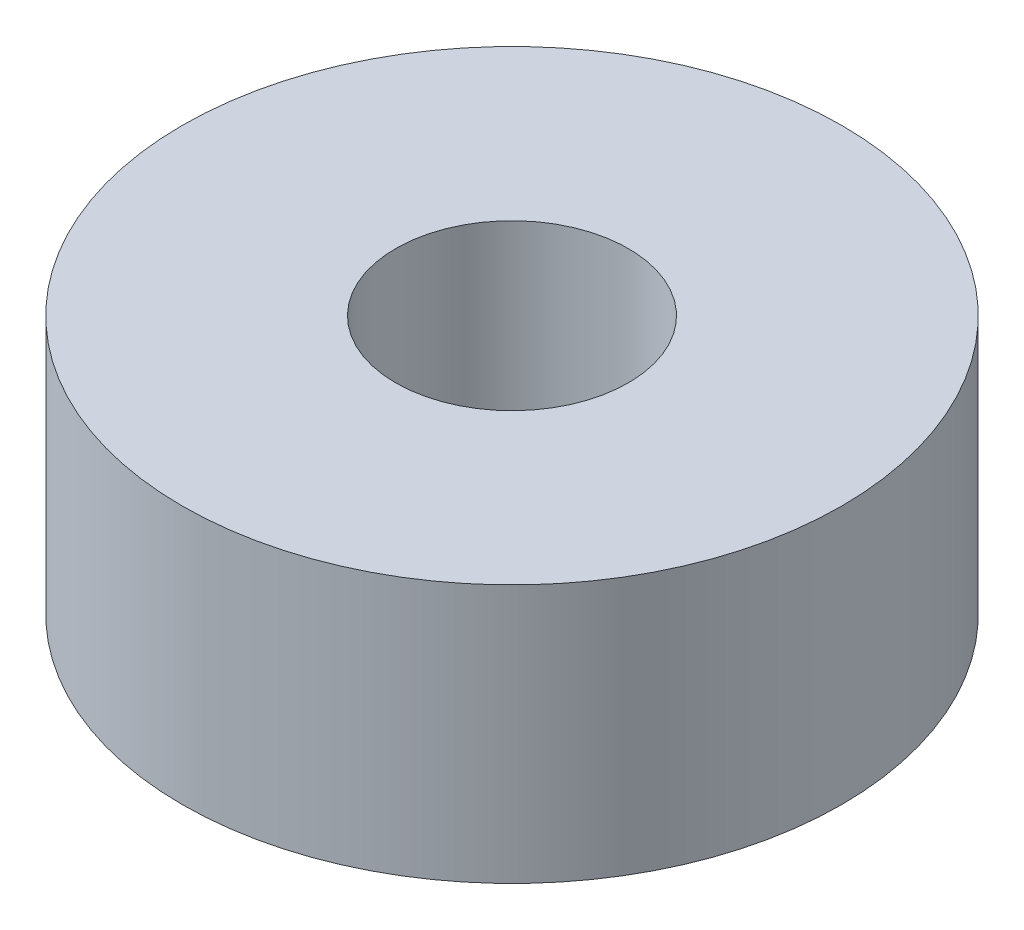
ISO-10303-21;
HEADER;
FILE_DESCRIPTION(('STEP AP214'),'2;1');
FILE_NAME('part.step','',(''),(''),'','','');
FILE_SCHEMA(('AUTOMOTIVE_DESIGN { 1 0 10303 214 1 1 1 1 }'));
ENDSEC;
DATA;
#1=APPLICATION_CONTEXT('core data for automotive mechanical design processes');
#2=APPLICATION_PROTOCOL_DEFINITION('international standard','automotive_design',2000,#1);
#3=PRODUCT_CONTEXT('',#1,'mechanical');
#4=PRODUCT('Part','Part','',(#3));
#5=PRODUCT_RELATED_PRODUCT_CATEGORY('part','',(#4));
#6=PRODUCT_DEFINITION_FORMATION('','',#4);
#7=PRODUCT_DEFINITION_CONTEXT('part definition',#1,'design');
#8=PRODUCT_DEFINITION('design','',#6,#7);
#9=PRODUCT_DEFINITION_SHAPE('','',#8);
#10=(LENGTH_UNIT() NAMED_UNIT(*) SI_UNIT(.MILLI.,.METRE.));
#11=(NAMED_UNIT(*) PLANE_ANGLE_UNIT() SI_UNIT($,.RADIAN.));
#12=(NAMED_UNIT(*) SI_UNIT($,.STERADIAN.) SOLID_ANGLE_UNIT());
#13=UNCERTAINTY_MEASURE_WITH_UNIT(LENGTH_MEASURE(1.E-05),#10,'distance_accuracy_value','');
#14=(GEOMETRIC_REPRESENTATION_CONTEXT(3) GLOBAL_UNCERTAINTY_ASSIGNED_CONTEXT((#13)) GLOBAL_UNIT_ASSIGNED_CONTEXT((#10,
#11,#12)) REPRESENTATION_CONTEXT('',''));
#15=CARTESIAN_POINT('',(0.,0.,0.));
#16=DIRECTION('',(0.,0.,1.));
#17=DIRECTION('',(1.,0.,0.));
#18=AXIS2_PLACEMENT_3D('',#15,#16,#17);
#19=CARTESIAN_POINT('',(0.,10.,0.));
#20=DIRECTION('',(0.,-1.,0.));
#21=DIRECTION('',(0.,0.,-1.));
#22=AXIS2_PLACEMENT_3D('',#19,#20,#21);
#23=CYLINDRICAL_SURFACE('',#22,12.75);
#24=CARTESIAN_POINT('',(0.,10.,0.));
#25=DIRECTION('',(0.,1.,0.));
#26=DIRECTION('',(0.,0.,1.));
#27=AXIS2_PLACEMENT_3D('',#24,#25,#26);
#28=CIRCLE('',#27,12.75);
#29=CARTESIAN_POINT('',(0.,10.,12.75));
#30=VERTEX_POINT('',#29);
#31=EDGE_CURVE('E10',#30,#30,#28,.T.);
#32=ORIENTED_EDGE('',*,*,#31,.F.);
#33=EDGE_LOOP('',(#32));
#34=FACE_BOUND('',#33,.T.);
#35=CARTESIAN_POINT('',(0.,0.,0.));
#36=DIRECTION('',(0.,1.,0.));
#37=DIRECTION('',(0.,0.,1.));
#38=AXIS2_PLACEMENT_3D('',#35,#36,#37);
#39=CIRCLE('',#38,12.75);
#40=CARTESIAN_POINT('',(0.,0.,12.75));
#41=VERTEX_POINT('',#40);
#42=EDGE_CURVE('E38',#41,#41,#39,.T.);
#43=ORIENTED_EDGE('',*,*,#42,.T.);
#44=EDGE_LOOP('',(#43));
#45=FACE_BOUND('',#44,.T.);
#46=ADVANCED_FACE('F35',(#34,#45),#23,.T.);
#47=CARTESIAN_POINT('',(0.,10.,0.));
#48=DIRECTION('',(0.,1.,0.));
#49=DIRECTION('',(0.,0.,1.));
#50=AXIS2_PLACEMENT_3D('',#47,#48,#49);
#51=PLANE('',#50);
#52=CARTESIAN_POINT('',(0.,10.,0.));
#53=DIRECTION('',(0.,1.,0.));
#54=DIRECTION('',(0.,0.,1.));
#55=AXIS2_PLACEMENT_3D('',#52,#53,#54);
#56=CIRCLE('',#55,4.5);
#57=CARTESIAN_POINT('',(0.,10.,4.5));
#58=VERTEX_POINT('',#57);
#59=EDGE_CURVE('E47',#58,#58,#56,.T.);
#60=ORIENTED_EDGE('',*,*,#59,.F.);
#61=EDGE_LOOP('',(#60));
#62=FACE_BOUND('',#61,.T.);
#63=ORIENTED_EDGE('',*,*,#31,.T.);
#64=EDGE_LOOP('',(#63));
#65=FACE_BOUND('',#64,.T.);
#66=ADVANCED_FACE('F72',(#62,#65),#51,.T.);
#67=CARTESIAN_POINT('',(0.,0.,0.));
#68=DIRECTION('',(0.,1.,0.));
#69=DIRECTION('',(0.,0.,1.));
#70=AXIS2_PLACEMENT_3D('',#67,#68,#69);
#71=PLANE('',#70);
#72=CARTESIAN_POINT('',(0.,0.,8.5));
#73=DIRECTION('',(0.,-1.,0.));
#74=DIRECTION('',(0.,0.,-1.));
#75=AXIS2_PLACEMENT_3D('',#72,#73,#74);
#76=CIRCLE('',#75,2.5);
#77=CARTESIAN_POINT('',(0.,0.,6.));
#78=VERTEX_POINT('',#77);
#79=EDGE_CURVE('E53',#78,#78,#76,.T.);
#80=ORIENTED_EDGE('',*,*,#79,.F.);
#81=EDGE_LOOP('',(#80));
#82=FACE_BOUND('',#81,.T.);
#83=ORIENTED_EDGE('',*,*,#42,.F.);
#84=EDGE_LOOP('',(#83));
#85=FACE_BOUND('',#84,.T.);
#86=ADVANCED_FACE('F68',(#82,#85),#71,.F.);
#87=CARTESIAN_POINT('',(0.,3.,0.));
#88=DIRECTION('',(0.,1.,0.));
#89=DIRECTION('',(0.,0.,1.));
#90=AXIS2_PLACEMENT_3D('',#87,#88,#89);
#91=CYLINDRICAL_SURFACE('',#90,4.5);
#92=CARTESIAN_POINT('',(0.,3.,0.));
#93=DIRECTION('',(0.,1.,0.));
#94=DIRECTION('',(0.,0.,1.));
#95=AXIS2_PLACEMENT_3D('',#92,#93,#94);
#96=CIRCLE('',#95,4.5);
#97=CARTESIAN_POINT('',(0.,3.,4.5));
#98=VERTEX_POINT('',#97);
#99=EDGE_CURVE('E45',#98,#98,#96,.T.);
#100=ORIENTED_EDGE('',*,*,#99,.F.);
#101=EDGE_LOOP('',(#100));
#102=FACE_BOUND('',#101,.T.);
#103=ORIENTED_EDGE('',*,*,#59,.T.);
#104=EDGE_LOOP('',(#103));
#105=FACE_BOUND('',#104,.T.);
#106=ADVANCED_FACE('F71',(#102,#105),#91,.F.);
#107=CARTESIAN_POINT('',(0.,3.,0.));
#108=DIRECTION('',(0.,1.,0.));
#109=DIRECTION('',(0.,0.,1.));
#110=AXIS2_PLACEMENT_3D('',#107,#108,#109);
#111=PLANE('',#110);
#112=ORIENTED_EDGE('',*,*,#99,.T.);
#113=EDGE_LOOP('',(#112));
#114=FACE_BOUND('',#113,.T.);
#115=ADVANCED_FACE('F64',(#114),#111,.T.);
#116=CARTESIAN_POINT('',(0.,7.,8.5));
#117=DIRECTION('',(0.,-1.,0.));
#118=DIRECTION('',(0.,0.,-1.));
#119=AXIS2_PLACEMENT_3D('',#116,#117,#118);
#120=CYLINDRICAL_SURFACE('',#119,2.5);
#121=CARTESIAN_POINT('',(0.,7.,8.5));
#122=DIRECTION('',(0.,-1.,0.));
#123=DIRECTION('',(0.,0.,-1.));
#124=AXIS2_PLACEMENT_3D('',#121,#122,#123);
#125=CIRCLE('',#124,2.5);
#126=CARTESIAN_POINT('',(0.,7.,6.));
#127=VERTEX_POINT('',#126);
#128=EDGE_CURVE('E50',#127,#127,#125,.T.);
#129=ORIENTED_EDGE('',*,*,#128,.F.);
#130=EDGE_LOOP('',(#129));
#131=FACE_BOUND('',#130,.T.);
#132=ORIENTED_EDGE('',*,*,#79,.T.);
#133=EDGE_LOOP('',(#132));
#134=FACE_BOUND('',#133,.T.);
#135=ADVANCED_FACE('F61',(#131,#134),#120,.F.);
#136=CARTESIAN_POINT('',(0.,7.,8.5));
#137=DIRECTION('',(0.,-1.,0.));
#138=DIRECTION('',(0.,0.,-1.));
#139=AXIS2_PLACEMENT_3D('',#136,#137,#138);
#140=PLANE('',#139);
#141=ORIENTED_EDGE('',*,*,#128,.T.);
#142=EDGE_LOOP('',(#141));
#143=FACE_BOUND('',#142,.T.);
#144=ADVANCED_FACE('F59',(#143),#140,.T.);
#145=CLOSED_SHELL('',(#46,#66,#86,#106,#115,#135,#144));
#146=MANIFOLD_SOLID_BREP('B2',#145);
#147=ADVANCED_BREP_SHAPE_REPRESENTATION('',(#18,#146),#14);
#148=SHAPE_DEFINITION_REPRESENTATION(#9,#147);
ENDSEC;
END-ISO-10303-21;
